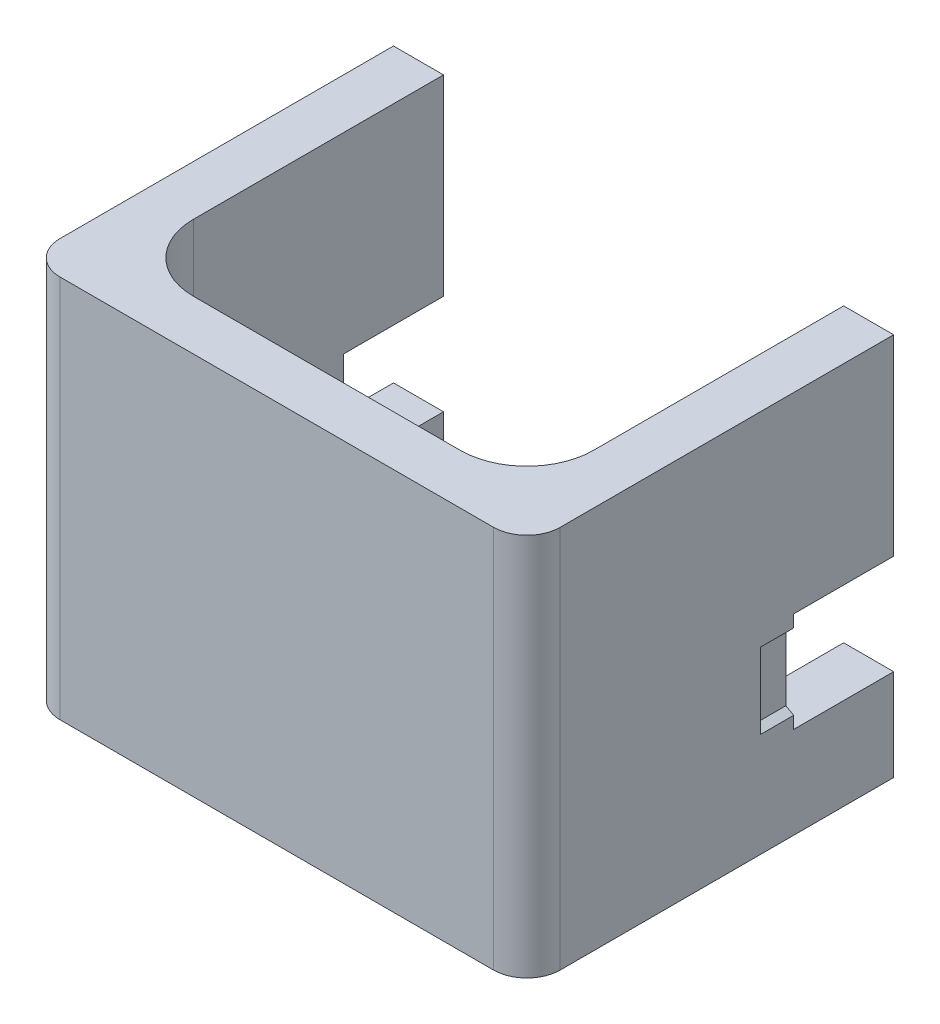
ISO-10303-21;
HEADER;
FILE_DESCRIPTION(('STEP AP214'),'2;1');
FILE_NAME('part.step','',(''),(''),'','','');
FILE_SCHEMA(('AUTOMOTIVE_DESIGN { 1 0 10303 214 1 1 1 1 }'));
ENDSEC;
DATA;
#1=APPLICATION_CONTEXT('core data for automotive mechanical design processes');
#2=APPLICATION_PROTOCOL_DEFINITION('international standard','automotive_design',2000,#1);
#3=PRODUCT_CONTEXT('',#1,'mechanical');
#4=PRODUCT('Part','Part','',(#3));
#5=PRODUCT_RELATED_PRODUCT_CATEGORY('part','',(#4));
#6=PRODUCT_DEFINITION_FORMATION('','',#4);
#7=PRODUCT_DEFINITION_CONTEXT('part definition',#1,'design');
#8=PRODUCT_DEFINITION('design','',#6,#7);
#9=PRODUCT_DEFINITION_SHAPE('','',#8);
#10=(LENGTH_UNIT() NAMED_UNIT(*) SI_UNIT(.MILLI.,.METRE.));
#11=(NAMED_UNIT(*) PLANE_ANGLE_UNIT() SI_UNIT($,.RADIAN.));
#12=(NAMED_UNIT(*) SI_UNIT($,.STERADIAN.) SOLID_ANGLE_UNIT());
#13=UNCERTAINTY_MEASURE_WITH_UNIT(LENGTH_MEASURE(1.E-05),#10,'distance_accuracy_value','');
#14=(GEOMETRIC_REPRESENTATION_CONTEXT(3) GLOBAL_UNCERTAINTY_ASSIGNED_CONTEXT((#13)) GLOBAL_UNIT_ASSIGNED_CONTEXT((#10,
#11,#12)) REPRESENTATION_CONTEXT('',''));
#15=CARTESIAN_POINT('',(0.,0.,0.));
#16=DIRECTION('',(0.,0.,1.));
#17=DIRECTION('',(1.,0.,0.));
#18=AXIS2_PLACEMENT_3D('',#15,#16,#17);
#19=CARTESIAN_POINT('',(7.5,0.,0.));
#20=DIRECTION('',(0.,0.,-1.));
#21=DIRECTION('',(-1.,0.,0.));
#22=AXIS2_PLACEMENT_3D('',#19,#20,#21);
#23=PLANE('',#22);
#24=DIRECTION('',(4.40795796513898E-09,1.,0.));
#25=VECTOR('',#24,1.);
#26=CARTESIAN_POINT('',(7.5,2.75,0.));
#27=LINE('',#26,#25);
#28=CARTESIAN_POINT('',(7.49999996253236,-5.75,0.));
#29=VERTEX_POINT('',#28);
#30=CARTESIAN_POINT('',(7.49999997465424,-2.99999999999994,0.));
#31=VERTEX_POINT('',#30);
#32=EDGE_CURVE('E318',#29,#31,#27,.T.);
#33=ORIENTED_EDGE('',*,*,#32,.F.);
#34=DIRECTION('',(1.,0.,0.));
#35=VECTOR('',#34,1.);
#36=CARTESIAN_POINT('',(6.,-5.75,0.));
#37=LINE('',#36,#35);
#38=CARTESIAN_POINT('',(6.,-5.75,0.));
#39=VERTEX_POINT('',#38);
#40=EDGE_CURVE('E326',#39,#29,#37,.T.);
#41=ORIENTED_EDGE('',*,*,#40,.F.);
#42=DIRECTION('',(0.,1.,0.));
#43=VECTOR('',#42,1.);
#44=CARTESIAN_POINT('',(6.,0.,0.));
#45=LINE('',#44,#43);
#46=CARTESIAN_POINT('',(6.,-2.99999999999994,0.));
#47=VERTEX_POINT('',#46);
#48=EDGE_CURVE('E205',#39,#47,#45,.T.);
#49=ORIENTED_EDGE('',*,*,#48,.T.);
#50=DIRECTION('',(1.,0.,0.));
#51=VECTOR('',#50,1.);
#52=CARTESIAN_POINT('',(6.75,-2.99999999999994,0.));
#53=LINE('',#52,#51);
#54=EDGE_CURVE('E329',#47,#31,#53,.T.);
#55=ORIENTED_EDGE('',*,*,#54,.T.);
#56=EDGE_LOOP('',(#33,#41,#49,#55));
#57=FACE_BOUND('',#56,.T.);
#58=ADVANCED_FACE('F41',(#57),#23,.T.);
#59=CARTESIAN_POINT('',(-6.,0.,0.));
#60=DIRECTION('',(0.,0.,-1.));
#61=DIRECTION('',(0.,-1.,0.));
#62=AXIS2_PLACEMENT_3D('',#59,#60,#61);
#63=PLANE('',#62);
#64=DIRECTION('',(-1.,0.,0.));
#65=VECTOR('',#64,1.);
#66=CARTESIAN_POINT('',(-6.75,0.,0.));
#67=LINE('',#66,#65);
#68=CARTESIAN_POINT('',(-6.,0.,0.));
#69=VERTEX_POINT('',#68);
#70=CARTESIAN_POINT('',(-7.50000001212188,0.,0.));
#71=VERTEX_POINT('',#70);
#72=EDGE_CURVE('E352',#69,#71,#67,.T.);
#73=ORIENTED_EDGE('',*,*,#72,.T.);
#74=DIRECTION('',(0.,1.,0.));
#75=VECTOR('',#74,1.);
#76=CARTESIAN_POINT('',(-7.5,0.,0.));
#77=LINE('',#76,#75);
#78=CARTESIAN_POINT('',(-7.5,5.75,0.));
#79=VERTEX_POINT('',#78);
#80=EDGE_CURVE('E405',#71,#79,#77,.T.);
#81=ORIENTED_EDGE('',*,*,#80,.T.);
#82=DIRECTION('',(-1.,0.,0.));
#83=VECTOR('',#82,1.);
#84=CARTESIAN_POINT('',(-7.5,5.75,0.));
#85=LINE('',#84,#83);
#86=CARTESIAN_POINT('',(-6.,5.75,0.));
#87=VERTEX_POINT('',#86);
#88=EDGE_CURVE('E406',#87,#79,#85,.T.);
#89=ORIENTED_EDGE('',*,*,#88,.F.);
#90=DIRECTION('',(0.,1.,0.));
#91=VECTOR('',#90,1.);
#92=CARTESIAN_POINT('',(-6.,0.,0.));
#93=LINE('',#92,#91);
#94=EDGE_CURVE('E535',#69,#87,#93,.T.);
#95=ORIENTED_EDGE('',*,*,#94,.F.);
#96=EDGE_LOOP('',(#73,#81,#89,#95));
#97=FACE_BOUND('',#96,.T.);
#98=ADVANCED_FACE('F747',(#97),#63,.T.);
#99=CARTESIAN_POINT('',(-4.68345473514375E-08,5.75,5.5));
#100=DIRECTION('',(0.,1.,0.));
#101=DIRECTION('',(1.,0.,0.));
#102=AXIS2_PLACEMENT_3D('',#99,#100,#101);
#103=PLANE('',#102);
#104=CARTESIAN_POINT('',(-6.5000000936691,5.75,10.));
#105=DIRECTION('',(0.,1.,0.));
#106=DIRECTION('',(-1.,0.,-9.36691169073357E-09));
#107=AXIS2_PLACEMENT_3D('',#104,#105,#106);
#108=CIRCLE('',#107,1.);
#109=CARTESIAN_POINT('',(-7.5000000936691,5.75,9.99999999063309));
#110=VERTEX_POINT('',#109);
#111=CARTESIAN_POINT('',(-6.50000009366909,5.75,11.));
#112=VERTEX_POINT('',#111);
#113=EDGE_CURVE('E11',#110,#112,#108,.T.);
#114=ORIENTED_EDGE('',*,*,#113,.T.);
#115=DIRECTION('',(1.,0.,0.));
#116=VECTOR('',#115,1.);
#117=CARTESIAN_POINT('',(6.49999990633091,5.75,11.));
#118=LINE('',#117,#116);
#119=CARTESIAN_POINT('',(6.49999990633091,5.75,11.));
#120=VERTEX_POINT('',#119);
#121=EDGE_CURVE('E430',#112,#120,#118,.T.);
#122=ORIENTED_EDGE('',*,*,#121,.T.);
#123=CARTESIAN_POINT('',(6.49999990633091,5.75,10.));
#124=DIRECTION('',(0.,1.,0.));
#125=DIRECTION('',(0.,0.,1.));
#126=AXIS2_PLACEMENT_3D('',#123,#124,#125);
#127=CIRCLE('',#126,1.);
#128=CARTESIAN_POINT('',(7.4999999063309,5.75,10.0000000093669));
#129=VERTEX_POINT('',#128);
#130=EDGE_CURVE('E454',#120,#129,#127,.T.);
#131=ORIENTED_EDGE('',*,*,#130,.T.);
#132=DIRECTION('',(9.36690968355822E-09,0.,-1.));
#133=VECTOR('',#132,1.);
#134=CARTESIAN_POINT('',(7.5,5.75,0.));
#135=LINE('',#134,#133);
#136=CARTESIAN_POINT('',(7.5,5.75,0.));
#137=VERTEX_POINT('',#136);
#138=EDGE_CURVE('E401',#129,#137,#135,.T.);
#139=ORIENTED_EDGE('',*,*,#138,.T.);
#140=DIRECTION('',(-1.,0.,0.));
#141=VECTOR('',#140,1.);
#142=CARTESIAN_POINT('',(6.,5.75,0.));
#143=LINE('',#142,#141);
#144=CARTESIAN_POINT('',(6.,5.75,0.));
#145=VERTEX_POINT('',#144);
#146=EDGE_CURVE('E449',#137,#145,#143,.T.);
#147=ORIENTED_EDGE('',*,*,#146,.T.);
#148=DIRECTION('',(0.,0.,1.));
#149=VECTOR('',#148,1.);
#150=CARTESIAN_POINT('',(6.,5.75,7.5));
#151=LINE('',#150,#149);
#152=CARTESIAN_POINT('',(6.,5.75,7.5));
#153=VERTEX_POINT('',#152);
#154=EDGE_CURVE('E477',#145,#153,#151,.T.);
#155=ORIENTED_EDGE('',*,*,#154,.T.);
#156=CARTESIAN_POINT('',(4.,5.75,7.5));
#157=DIRECTION('',(0.,-1.,0.));
#158=DIRECTION('',(0.,0.,1.));
#159=AXIS2_PLACEMENT_3D('',#156,#157,#158);
#160=CIRCLE('',#159,2.);
#161=CARTESIAN_POINT('',(4.,5.75,9.5));
#162=VERTEX_POINT('',#161);
#163=EDGE_CURVE('E446',#153,#162,#160,.T.);
#164=ORIENTED_EDGE('',*,*,#163,.T.);
#165=DIRECTION('',(-1.,0.,0.));
#166=VECTOR('',#165,1.);
#167=CARTESIAN_POINT('',(-4.,5.75,9.5));
#168=LINE('',#167,#166);
#169=CARTESIAN_POINT('',(-4.,5.75,9.5));
#170=VERTEX_POINT('',#169);
#171=EDGE_CURVE('E537',#162,#170,#168,.T.);
#172=ORIENTED_EDGE('',*,*,#171,.T.);
#173=CARTESIAN_POINT('',(-4.,5.75,7.5));
#174=DIRECTION('',(0.,-1.,0.));
#175=DIRECTION('',(-1.,0.,0.));
#176=AXIS2_PLACEMENT_3D('',#173,#174,#175);
#177=CIRCLE('',#176,2.);
#178=CARTESIAN_POINT('',(-6.,5.75,7.5));
#179=VERTEX_POINT('',#178);
#180=EDGE_CURVE('E409',#170,#179,#177,.T.);
#181=ORIENTED_EDGE('',*,*,#180,.T.);
#182=DIRECTION('',(0.,0.,-1.));
#183=VECTOR('',#182,1.);
#184=CARTESIAN_POINT('',(-6.,5.75,0.));
#185=LINE('',#184,#183);
#186=EDGE_CURVE('E350',#179,#87,#185,.T.);
#187=ORIENTED_EDGE('',*,*,#186,.T.);
#188=ORIENTED_EDGE('',*,*,#88,.T.);
#189=DIRECTION('',(-9.36690947906141E-09,0.,1.));
#190=VECTOR('',#189,1.);
#191=CARTESIAN_POINT('',(-7.5000000936691,5.75,9.99999999063309));
#192=LINE('',#191,#190);
#193=EDGE_CURVE('E402',#79,#110,#192,.T.);
#194=ORIENTED_EDGE('',*,*,#193,.T.);
#195=EDGE_LOOP('',(#114,#122,#131,#139,#147,#155,#164,#172,#181,#187,#188,#194));
#196=FACE_BOUND('',#195,.T.);
#197=ADVANCED_FACE('F754',(#196),#103,.T.);
#198=CARTESIAN_POINT('',(-6.5000000936691,0.,10.));
#199=DIRECTION('',(0.,1.,0.));
#200=DIRECTION('',(-1.,0.,-9.36691169073357E-09));
#201=AXIS2_PLACEMENT_3D('',#198,#199,#200);
#202=CYLINDRICAL_SURFACE('',#201,1.);
#203=DIRECTION('',(0.,1.,0.));
#204=VECTOR('',#203,1.);
#205=CARTESIAN_POINT('',(-6.50000009366909,0.,11.));
#206=LINE('',#205,#204);
#207=CARTESIAN_POINT('',(-6.50000009366909,-5.75,11.));
#208=VERTEX_POINT('',#207);
#209=EDGE_CURVE('E52',#208,#112,#206,.T.);
#210=ORIENTED_EDGE('',*,*,#209,.T.);
#211=ORIENTED_EDGE('',*,*,#113,.F.);
#212=DIRECTION('',(0.,-1.,0.));
#213=VECTOR('',#212,1.);
#214=CARTESIAN_POINT('',(-7.5000000936691,0.,9.99999999063309));
#215=LINE('',#214,#213);
#216=CARTESIAN_POINT('',(-7.5000000936691,-5.75,9.99999999063309));
#217=VERTEX_POINT('',#216);
#218=EDGE_CURVE('E233',#110,#217,#215,.T.);
#219=ORIENTED_EDGE('',*,*,#218,.T.);
#220=CARTESIAN_POINT('',(-6.5000000936691,-5.75,10.));
#221=DIRECTION('',(0.,-1.,0.));
#222=DIRECTION('',(-1.,0.,-9.36691169073357E-09));
#223=AXIS2_PLACEMENT_3D('',#220,#221,#222);
#224=CIRCLE('',#223,1.);
#225=EDGE_CURVE('E324',#208,#217,#224,.T.);
#226=ORIENTED_EDGE('',*,*,#225,.F.);
#227=EDGE_LOOP('',(#210,#211,#219,#226));
#228=FACE_BOUND('',#227,.T.);
#229=ADVANCED_FACE('F946',(#228),#202,.T.);
#230=CARTESIAN_POINT('',(-6.50000009366909,0.,11.));
#231=DIRECTION('',(0.,0.,1.));
#232=DIRECTION('',(1.,0.,0.));
#233=AXIS2_PLACEMENT_3D('',#230,#231,#232);
#234=PLANE('',#233);
#235=DIRECTION('',(0.,1.,0.));
#236=VECTOR('',#235,1.);
#237=CARTESIAN_POINT('',(6.49999990633091,0.,11.));
#238=LINE('',#237,#236);
#239=CARTESIAN_POINT('',(6.49999990633091,-5.75,11.));
#240=VERTEX_POINT('',#239);
#241=EDGE_CURVE('E450',#240,#120,#238,.T.);
#242=ORIENTED_EDGE('',*,*,#241,.T.);
#243=ORIENTED_EDGE('',*,*,#121,.F.);
#244=ORIENTED_EDGE('',*,*,#209,.F.);
#245=DIRECTION('',(-1.,0.,0.));
#246=VECTOR('',#245,1.);
#247=CARTESIAN_POINT('',(6.49999990633091,-5.75,11.));
#248=LINE('',#247,#246);
#249=EDGE_CURVE('E344',#240,#208,#248,.T.);
#250=ORIENTED_EDGE('',*,*,#249,.F.);
#251=EDGE_LOOP('',(#242,#243,#244,#250));
#252=FACE_BOUND('',#251,.T.);
#253=ADVANCED_FACE('F768',(#252),#234,.T.);
#254=CARTESIAN_POINT('',(6.49999990633091,0.,10.));
#255=DIRECTION('',(0.,1.,0.));
#256=DIRECTION('',(0.,0.,1.));
#257=AXIS2_PLACEMENT_3D('',#254,#255,#256);
#258=CYLINDRICAL_SURFACE('',#257,1.);
#259=DIRECTION('',(0.,1.,0.));
#260=VECTOR('',#259,1.);
#261=CARTESIAN_POINT('',(7.4999999063309,0.,10.0000000093669));
#262=LINE('',#261,#260);
#263=CARTESIAN_POINT('',(7.4999999063309,-5.75,10.0000000093669));
#264=VERTEX_POINT('',#263);
#265=EDGE_CURVE('E320',#264,#129,#262,.T.);
#266=ORIENTED_EDGE('',*,*,#265,.T.);
#267=ORIENTED_EDGE('',*,*,#130,.F.);
#268=ORIENTED_EDGE('',*,*,#241,.F.);
#269=CARTESIAN_POINT('',(6.49999990633091,-5.75,10.));
#270=DIRECTION('',(0.,-1.,0.));
#271=DIRECTION('',(0.,0.,1.));
#272=AXIS2_PLACEMENT_3D('',#269,#270,#271);
#273=CIRCLE('',#272,1.);
#274=EDGE_CURVE('E337',#264,#240,#273,.T.);
#275=ORIENTED_EDGE('',*,*,#274,.F.);
#276=EDGE_LOOP('',(#266,#267,#268,#275));
#277=FACE_BOUND('',#276,.T.);
#278=ADVANCED_FACE('F760',(#277),#258,.T.);
#279=DIRECTION('',(0.,1.,0.));
#280=VECTOR('',#279,1.);
#281=CARTESIAN_POINT('',(7.5,0.,0.));
#282=LINE('',#281,#280);
#283=CARTESIAN_POINT('',(7.49999998787812,0.,0.));
#284=VERTEX_POINT('',#283);
#285=EDGE_CURVE('E397',#284,#137,#282,.T.);
#286=ORIENTED_EDGE('',*,*,#285,.F.);
#287=DIRECTION('',(-1.,0.,0.));
#288=VECTOR('',#287,1.);
#289=CARTESIAN_POINT('',(7.5,0.,0.));
#290=LINE('',#289,#288);
#291=CARTESIAN_POINT('',(6.,0.,0.));
#292=VERTEX_POINT('',#291);
#293=EDGE_CURVE('E487',#284,#292,#290,.T.);
#294=ORIENTED_EDGE('',*,*,#293,.T.);
#295=DIRECTION('',(0.,1.,0.));
#296=VECTOR('',#295,1.);
#297=CARTESIAN_POINT('',(6.,0.,0.));
#298=LINE('',#297,#296);
#299=EDGE_CURVE('E216',#292,#145,#298,.T.);
#300=ORIENTED_EDGE('',*,*,#299,.T.);
#301=ORIENTED_EDGE('',*,*,#146,.F.);
#302=EDGE_LOOP('',(#286,#294,#300,#301));
#303=FACE_BOUND('',#302,.T.);
#304=ADVANCED_FACE('F748',(#303),#23,.T.);
#305=CARTESIAN_POINT('',(4.,0.,7.5));
#306=DIRECTION('',(0.,1.,0.));
#307=DIRECTION('',(0.,0.,1.));
#308=AXIS2_PLACEMENT_3D('',#305,#306,#307);
#309=CYLINDRICAL_SURFACE('',#308,2.);
#310=DIRECTION('',(0.,1.,0.));
#311=VECTOR('',#310,1.);
#312=CARTESIAN_POINT('',(4.,0.,9.5));
#313=LINE('',#312,#311);
#314=CARTESIAN_POINT('',(4.,-5.75,9.5));
#315=VERTEX_POINT('',#314);
#316=EDGE_CURVE('E249',#315,#162,#313,.T.);
#317=ORIENTED_EDGE('',*,*,#316,.T.);
#318=ORIENTED_EDGE('',*,*,#163,.F.);
#319=DIRECTION('',(0.,1.,0.));
#320=VECTOR('',#319,1.);
#321=CARTESIAN_POINT('',(6.,0.,7.5));
#322=LINE('',#321,#320);
#323=CARTESIAN_POINT('',(6.,-5.75,7.5));
#324=VERTEX_POINT('',#323);
#325=EDGE_CURVE('E396',#324,#153,#322,.T.);
#326=ORIENTED_EDGE('',*,*,#325,.F.);
#327=CARTESIAN_POINT('',(4.,-5.75,7.5));
#328=DIRECTION('',(0.,1.,0.));
#329=DIRECTION('',(0.,0.,1.));
#330=AXIS2_PLACEMENT_3D('',#327,#328,#329);
#331=CIRCLE('',#330,2.);
#332=EDGE_CURVE('E338',#315,#324,#331,.T.);
#333=ORIENTED_EDGE('',*,*,#332,.F.);
#334=EDGE_LOOP('',(#317,#318,#326,#333));
#335=FACE_BOUND('',#334,.T.);
#336=ADVANCED_FACE('F759',(#335),#309,.F.);
#337=CARTESIAN_POINT('',(4.,0.,9.5));
#338=DIRECTION('',(0.,0.,-1.));
#339=DIRECTION('',(-1.,0.,0.));
#340=AXIS2_PLACEMENT_3D('',#337,#338,#339);
#341=PLANE('',#340);
#342=DIRECTION('',(0.,1.,0.));
#343=VECTOR('',#342,1.);
#344=CARTESIAN_POINT('',(-4.,0.,9.5));
#345=LINE('',#344,#343);
#346=CARTESIAN_POINT('',(-4.,-5.75,9.5));
#347=VERTEX_POINT('',#346);
#348=EDGE_CURVE('E240',#347,#170,#345,.T.);
#349=ORIENTED_EDGE('',*,*,#348,.T.);
#350=ORIENTED_EDGE('',*,*,#171,.F.);
#351=ORIENTED_EDGE('',*,*,#316,.F.);
#352=DIRECTION('',(1.,0.,0.));
#353=VECTOR('',#352,1.);
#354=CARTESIAN_POINT('',(-4.,-5.75,9.5));
#355=LINE('',#354,#353);
#356=EDGE_CURVE('E346',#347,#315,#355,.T.);
#357=ORIENTED_EDGE('',*,*,#356,.F.);
#358=EDGE_LOOP('',(#349,#350,#351,#357));
#359=FACE_BOUND('',#358,.T.);
#360=ADVANCED_FACE('F765',(#359),#341,.T.);
#361=CARTESIAN_POINT('',(-4.,0.,7.5));
#362=DIRECTION('',(0.,1.,0.));
#363=DIRECTION('',(-1.,0.,0.));
#364=AXIS2_PLACEMENT_3D('',#361,#362,#363);
#365=CYLINDRICAL_SURFACE('',#364,2.);
#366=DIRECTION('',(0.,1.,0.));
#367=VECTOR('',#366,1.);
#368=CARTESIAN_POINT('',(-6.,0.,7.5));
#369=LINE('',#368,#367);
#370=CARTESIAN_POINT('',(-6.,-5.75,7.5));
#371=VERTEX_POINT('',#370);
#372=EDGE_CURVE('E523',#371,#179,#369,.T.);
#373=ORIENTED_EDGE('',*,*,#372,.T.);
#374=ORIENTED_EDGE('',*,*,#180,.F.);
#375=ORIENTED_EDGE('',*,*,#348,.F.);
#376=CARTESIAN_POINT('',(-4.,-5.75,7.5));
#377=DIRECTION('',(0.,1.,0.));
#378=DIRECTION('',(-1.,0.,0.));
#379=AXIS2_PLACEMENT_3D('',#376,#377,#378);
#380=CIRCLE('',#379,2.);
#381=EDGE_CURVE('E455',#371,#347,#380,.T.);
#382=ORIENTED_EDGE('',*,*,#381,.F.);
#383=EDGE_LOOP('',(#373,#374,#375,#382));
#384=FACE_BOUND('',#383,.T.);
#385=ADVANCED_FACE('F43',(#384),#365,.F.);
#386=DIRECTION('',(-4.4079576590113E-09,-1.,0.));
#387=VECTOR('',#386,1.);
#388=CARTESIAN_POINT('',(-7.5,2.75,0.));
#389=LINE('',#388,#387);
#390=CARTESIAN_POINT('',(-7.50000002534576,-2.99999999999994,0.));
#391=VERTEX_POINT('',#390);
#392=CARTESIAN_POINT('',(-7.50000003746764,-5.75,0.));
#393=VERTEX_POINT('',#392);
#394=EDGE_CURVE('E724',#391,#393,#389,.T.);
#395=ORIENTED_EDGE('',*,*,#394,.F.);
#396=DIRECTION('',(1.,0.,0.));
#397=VECTOR('',#396,1.);
#398=CARTESIAN_POINT('',(-6.,-2.99999999999994,0.));
#399=LINE('',#398,#397);
#400=CARTESIAN_POINT('',(-6.,-2.99999999999994,0.));
#401=VERTEX_POINT('',#400);
#402=EDGE_CURVE('E356',#391,#401,#399,.T.);
#403=ORIENTED_EDGE('',*,*,#402,.T.);
#404=DIRECTION('',(0.,1.,0.));
#405=VECTOR('',#404,1.);
#406=CARTESIAN_POINT('',(-6.,0.,0.));
#407=LINE('',#406,#405);
#408=CARTESIAN_POINT('',(-6.,-5.75,0.));
#409=VERTEX_POINT('',#408);
#410=EDGE_CURVE('E410',#409,#401,#407,.T.);
#411=ORIENTED_EDGE('',*,*,#410,.F.);
#412=DIRECTION('',(-1.,0.,0.));
#413=VECTOR('',#412,1.);
#414=CARTESIAN_POINT('',(-7.5,-5.75,0.));
#415=LINE('',#414,#413);
#416=EDGE_CURVE('E195',#409,#393,#415,.T.);
#417=ORIENTED_EDGE('',*,*,#416,.T.);
#418=EDGE_LOOP('',(#395,#403,#411,#417));
#419=FACE_BOUND('',#418,.T.);
#420=ADVANCED_FACE('F757',(#419),#63,.T.);
#421=CARTESIAN_POINT('',(-7.5,0.,0.));
#422=DIRECTION('',(-1.,0.,-9.36690947906141E-09));
#423=DIRECTION('',(-9.36690947906141E-09,0.,1.));
#424=AXIS2_PLACEMENT_3D('',#421,#422,#423);
#425=PLANE('',#424);
#426=DIRECTION('',(9.36690947906141E-09,0.,-1.));
#427=VECTOR('',#426,1.);
#428=CARTESIAN_POINT('',(-7.5000000936691,-5.75,9.99999999063309));
#429=LINE('',#428,#427);
#430=EDGE_CURVE('E485',#217,#393,#429,.T.);
#431=ORIENTED_EDGE('',*,*,#430,.F.);
#432=ORIENTED_EDGE('',*,*,#218,.F.);
#433=ORIENTED_EDGE('',*,*,#193,.F.);
#434=ORIENTED_EDGE('',*,*,#80,.F.);
#435=DIRECTION('',(0.,0.,1.));
#436=VECTOR('',#435,1.);
#437=CARTESIAN_POINT('',(-7.5,0.,0.));
#438=LINE('',#437,#436);
#439=CARTESIAN_POINT('',(-7.50000001212188,0.,3.));
#440=VERTEX_POINT('',#439);
#441=EDGE_CURVE('E414',#71,#440,#438,.T.);
#442=ORIENTED_EDGE('',*,*,#441,.T.);
#443=DIRECTION('',(0.,-1.,0.));
#444=VECTOR('',#443,1.);
#445=CARTESIAN_POINT('',(-7.5,0.,3.));
#446=LINE('',#445,#444);
#447=CARTESIAN_POINT('',(-7.5,-0.366025403784376,3.));
#448=VERTEX_POINT('',#447);
#449=EDGE_CURVE('E427',#440,#448,#446,.T.);
#450=ORIENTED_EDGE('',*,*,#449,.T.);
#451=DIRECTION('',(0.,0.,1.));
#452=VECTOR('',#451,1.);
#453=CARTESIAN_POINT('',(-7.50000001373531,-0.366025395854292,3.));
#454=LINE('',#453,#452);
#455=CARTESIAN_POINT('',(-7.50000001373531,-0.366025382152428,4.));
#456=VERTEX_POINT('',#455);
#457=EDGE_CURVE('E558',#448,#456,#454,.T.);
#458=ORIENTED_EDGE('',*,*,#457,.T.);
#459=DIRECTION('',(0.,1.,0.));
#460=VECTOR('',#459,1.);
#461=CARTESIAN_POINT('',(-7.50000003746764,-0.75,4.00000000936691));
#462=LINE('',#461,#460);
#463=CARTESIAN_POINT('',(-7.50000003746764,-2.63397461784745,4.));
#464=VERTEX_POINT('',#463);
#465=EDGE_CURVE('E364',#464,#456,#462,.T.);
#466=ORIENTED_EDGE('',*,*,#465,.F.);
#467=DIRECTION('',(0.,0.,-1.));
#468=VECTOR('',#467,1.);
#469=CARTESIAN_POINT('',(-7.50000002373233,-2.63397460991737,3.));
#470=LINE('',#469,#468);
#471=CARTESIAN_POINT('',(-7.50000002373233,-2.63397460991737,3.));
#472=VERTEX_POINT('',#471);
#473=EDGE_CURVE('E722',#464,#472,#470,.T.);
#474=ORIENTED_EDGE('',*,*,#473,.T.);
#475=DIRECTION('',(0.,-1.,0.));
#476=VECTOR('',#475,1.);
#477=CARTESIAN_POINT('',(-7.5,0.,3.));
#478=LINE('',#477,#476);
#479=CARTESIAN_POINT('',(-7.50000002534576,-2.99999999999994,3.));
#480=VERTEX_POINT('',#479);
#481=EDGE_CURVE('E374',#472,#480,#478,.T.);
#482=ORIENTED_EDGE('',*,*,#481,.T.);
#483=DIRECTION('',(0.,0.,1.));
#484=VECTOR('',#483,1.);
#485=CARTESIAN_POINT('',(-7.5,-2.99999999999994,0.));
#486=LINE('',#485,#484);
#487=EDGE_CURVE('E437',#391,#480,#486,.T.);
#488=ORIENTED_EDGE('',*,*,#487,.F.);
#489=ORIENTED_EDGE('',*,*,#394,.T.);
#490=EDGE_LOOP('',(#431,#432,#433,#434,#442,#450,#458,#466,#474,#482,#488,#489));
#491=FACE_BOUND('',#490,.T.);
#492=ADVANCED_FACE('F826',(#491),#425,.T.);
#493=CARTESIAN_POINT('',(-4.68345473514375E-08,-5.75,5.5));
#494=DIRECTION('',(0.,1.,0.));
#495=DIRECTION('',(1.,0.,0.));
#496=AXIS2_PLACEMENT_3D('',#493,#494,#495);
#497=PLANE('',#496);
#498=ORIENTED_EDGE('',*,*,#40,.T.);
#499=DIRECTION('',(-9.36690968355822E-09,0.,1.));
#500=VECTOR('',#499,1.);
#501=CARTESIAN_POINT('',(7.5,-5.75,0.));
#502=LINE('',#501,#500);
#503=EDGE_CURVE('E314',#29,#264,#502,.T.);
#504=ORIENTED_EDGE('',*,*,#503,.T.);
#505=ORIENTED_EDGE('',*,*,#274,.T.);
#506=ORIENTED_EDGE('',*,*,#249,.T.);
#507=ORIENTED_EDGE('',*,*,#225,.T.);
#508=ORIENTED_EDGE('',*,*,#430,.T.);
#509=ORIENTED_EDGE('',*,*,#416,.F.);
#510=DIRECTION('',(0.,0.,1.));
#511=VECTOR('',#510,1.);
#512=CARTESIAN_POINT('',(-6.,-5.75,0.));
#513=LINE('',#512,#511);
#514=EDGE_CURVE('E415',#409,#371,#513,.T.);
#515=ORIENTED_EDGE('',*,*,#514,.T.);
#516=ORIENTED_EDGE('',*,*,#381,.T.);
#517=ORIENTED_EDGE('',*,*,#356,.T.);
#518=ORIENTED_EDGE('',*,*,#332,.T.);
#519=DIRECTION('',(0.,0.,-1.));
#520=VECTOR('',#519,1.);
#521=CARTESIAN_POINT('',(6.,-5.75,7.5));
#522=LINE('',#521,#520);
#523=EDGE_CURVE('E335',#324,#39,#522,.T.);
#524=ORIENTED_EDGE('',*,*,#523,.T.);
#525=EDGE_LOOP('',(#498,#504,#505,#506,#507,#508,#509,#515,#516,#517,#518,#524));
#526=FACE_BOUND('',#525,.T.);
#527=ADVANCED_FACE('F333',(#526),#497,.F.);
#528=CARTESIAN_POINT('',(7.4999999063309,0.,10.0000000093669));
#529=DIRECTION('',(1.,0.,9.36690968355822E-09));
#530=DIRECTION('',(0.,-1.,0.));
#531=AXIS2_PLACEMENT_3D('',#528,#529,#530);
#532=PLANE('',#531);
#533=DIRECTION('',(0.,0.,1.));
#534=VECTOR('',#533,1.);
#535=CARTESIAN_POINT('',(7.5,0.,0.));
#536=LINE('',#535,#534);
#537=CARTESIAN_POINT('',(7.49999998787812,0.,3.));
#538=VERTEX_POINT('',#537);
#539=EDGE_CURVE('E431',#284,#538,#536,.T.);
#540=ORIENTED_EDGE('',*,*,#539,.F.);
#541=ORIENTED_EDGE('',*,*,#285,.T.);
#542=ORIENTED_EDGE('',*,*,#138,.F.);
#543=ORIENTED_EDGE('',*,*,#265,.F.);
#544=ORIENTED_EDGE('',*,*,#503,.F.);
#545=ORIENTED_EDGE('',*,*,#32,.T.);
#546=DIRECTION('',(0.,0.,1.));
#547=VECTOR('',#546,1.);
#548=CARTESIAN_POINT('',(7.5,-2.99999999999994,0.));
#549=LINE('',#548,#547);
#550=CARTESIAN_POINT('',(7.49999997465424,-2.99999999999994,3.));
#551=VERTEX_POINT('',#550);
#552=EDGE_CURVE('E530',#31,#551,#549,.T.);
#553=ORIENTED_EDGE('',*,*,#552,.T.);
#554=DIRECTION('',(0.,-1.,0.));
#555=VECTOR('',#554,1.);
#556=CARTESIAN_POINT('',(7.5,0.,3.));
#557=LINE('',#556,#555);
#558=CARTESIAN_POINT('',(7.5,-2.6339745962155,3.));
#559=VERTEX_POINT('',#558);
#560=EDGE_CURVE('E526',#559,#551,#557,.T.);
#561=ORIENTED_EDGE('',*,*,#560,.F.);
#562=DIRECTION('',(0.,0.,-1.));
#563=VECTOR('',#562,1.);
#564=CARTESIAN_POINT('',(7.49999997626767,-2.63397458251363,3.));
#565=LINE('',#564,#563);
#566=CARTESIAN_POINT('',(7.49999997626767,-2.63397458251363,4.));
#567=VERTEX_POINT('',#566);
#568=EDGE_CURVE('E331',#567,#559,#565,.T.);
#569=ORIENTED_EDGE('',*,*,#568,.F.);
#570=DIRECTION('',(0.,-1.,0.));
#571=VECTOR('',#570,1.);
#572=CARTESIAN_POINT('',(7.49999996253236,-0.75,3.99999999063309));
#573=LINE('',#572,#571);
#574=CARTESIAN_POINT('',(7.49999996253236,-0.366025425416329,4.));
#575=VERTEX_POINT('',#574);
#576=EDGE_CURVE('E361',#575,#567,#573,.T.);
#577=ORIENTED_EDGE('',*,*,#576,.F.);
#578=DIRECTION('',(0.,0.,1.));
#579=VECTOR('',#578,1.);
#580=CARTESIAN_POINT('',(7.49999998626469,-0.366025411714459,3.));
#581=LINE('',#580,#579);
#582=CARTESIAN_POINT('',(7.49999998626469,-0.366025411714459,3.));
#583=VERTEX_POINT('',#582);
#584=EDGE_CURVE('E728',#583,#575,#581,.T.);
#585=ORIENTED_EDGE('',*,*,#584,.F.);
#586=DIRECTION('',(0.,-1.,0.));
#587=VECTOR('',#586,1.);
#588=CARTESIAN_POINT('',(7.5,0.,3.));
#589=LINE('',#588,#587);
#590=EDGE_CURVE('E435',#538,#583,#589,.T.);
#591=ORIENTED_EDGE('',*,*,#590,.F.);
#592=EDGE_LOOP('',(#540,#541,#542,#543,#544,#545,#553,#561,#569,#577,#585,#591));
#593=FACE_BOUND('',#592,.T.);
#594=ADVANCED_FACE('F317',(#593),#532,.T.);
#595=CARTESIAN_POINT('',(6.,0.,0.));
#596=DIRECTION('',(-1.,0.,0.));
#597=DIRECTION('',(0.,0.,1.));
#598=AXIS2_PLACEMENT_3D('',#595,#596,#597);
#599=PLANE('',#598);
#600=DIRECTION('',(0.,0.,-1.));
#601=VECTOR('',#600,1.);
#602=CARTESIAN_POINT('',(6.,-2.99999999999994,0.));
#603=LINE('',#602,#601);
#604=CARTESIAN_POINT('',(6.,-2.99999999999994,3.));
#605=VERTEX_POINT('',#604);
#606=EDGE_CURVE('E490',#605,#47,#603,.T.);
#607=ORIENTED_EDGE('',*,*,#606,.T.);
#608=ORIENTED_EDGE('',*,*,#48,.F.);
#609=ORIENTED_EDGE('',*,*,#523,.F.);
#610=ORIENTED_EDGE('',*,*,#325,.T.);
#611=ORIENTED_EDGE('',*,*,#154,.F.);
#612=ORIENTED_EDGE('',*,*,#299,.F.);
#613=DIRECTION('',(0.,0.,1.));
#614=VECTOR('',#613,1.);
#615=CARTESIAN_POINT('',(6.,0.,0.));
#616=LINE('',#615,#614);
#617=CARTESIAN_POINT('',(6.,0.,3.));
#618=VERTEX_POINT('',#617);
#619=EDGE_CURVE('E469',#292,#618,#616,.T.);
#620=ORIENTED_EDGE('',*,*,#619,.T.);
#621=DIRECTION('',(0.,-1.,0.));
#622=VECTOR('',#621,1.);
#623=CARTESIAN_POINT('',(6.,-0.74999999999997,3.));
#624=LINE('',#623,#622);
#625=EDGE_CURVE('E441',#618,#605,#624,.T.);
#626=ORIENTED_EDGE('',*,*,#625,.T.);
#627=EDGE_LOOP('',(#607,#608,#609,#610,#611,#612,#620,#626));
#628=FACE_BOUND('',#627,.T.);
#629=ADVANCED_FACE('F775',(#628),#599,.T.);
#630=CARTESIAN_POINT('',(7.5,0.,0.));
#631=DIRECTION('',(0.,1.,0.));
#632=DIRECTION('',(1.,0.,0.));
#633=AXIS2_PLACEMENT_3D('',#630,#631,#632);
#634=PLANE('',#633);
#635=ORIENTED_EDGE('',*,*,#293,.F.);
#636=ORIENTED_EDGE('',*,*,#539,.T.);
#637=DIRECTION('',(1.,0.,0.));
#638=VECTOR('',#637,1.);
#639=CARTESIAN_POINT('',(6.,0.,3.));
#640=LINE('',#639,#638);
#641=EDGE_CURVE('E445',#618,#538,#640,.T.);
#642=ORIENTED_EDGE('',*,*,#641,.F.);
#643=ORIENTED_EDGE('',*,*,#619,.F.);
#644=EDGE_LOOP('',(#635,#636,#642,#643));
#645=FACE_BOUND('',#644,.T.);
#646=ADVANCED_FACE('F773',(#645),#634,.F.);
#647=CARTESIAN_POINT('',(6.,-2.99999999999994,0.));
#648=DIRECTION('',(0.,-1.,0.));
#649=DIRECTION('',(0.,0.,-1.));
#650=AXIS2_PLACEMENT_3D('',#647,#648,#649);
#651=PLANE('',#650);
#652=ORIENTED_EDGE('',*,*,#54,.F.);
#653=ORIENTED_EDGE('',*,*,#606,.F.);
#654=DIRECTION('',(-1.,0.,0.));
#655=VECTOR('',#654,1.);
#656=CARTESIAN_POINT('',(7.5,-2.99999999999994,3.));
#657=LINE('',#656,#655);
#658=EDGE_CURVE('E434',#551,#605,#657,.T.);
#659=ORIENTED_EDGE('',*,*,#658,.F.);
#660=ORIENTED_EDGE('',*,*,#552,.F.);
#661=EDGE_LOOP('',(#652,#653,#659,#660));
#662=FACE_BOUND('',#661,.T.);
#663=ADVANCED_FACE('F778',(#662),#651,.F.);
#664=CARTESIAN_POINT('',(-7.5,0.,0.));
#665=DIRECTION('',(0.,-1.,0.));
#666=DIRECTION('',(0.,0.,-1.));
#667=AXIS2_PLACEMENT_3D('',#664,#665,#666);
#668=PLANE('',#667);
#669=ORIENTED_EDGE('',*,*,#72,.F.);
#670=DIRECTION('',(0.,0.,-1.));
#671=VECTOR('',#670,1.);
#672=CARTESIAN_POINT('',(-6.,0.,3.75));
#673=LINE('',#672,#671);
#674=CARTESIAN_POINT('',(-6.,0.,3.));
#675=VERTEX_POINT('',#674);
#676=EDGE_CURVE('E531',#675,#69,#673,.T.);
#677=ORIENTED_EDGE('',*,*,#676,.F.);
#678=DIRECTION('',(-1.,0.,0.));
#679=VECTOR('',#678,1.);
#680=CARTESIAN_POINT('',(-6.,0.,3.));
#681=LINE('',#680,#679);
#682=EDGE_CURVE('E422',#675,#440,#681,.T.);
#683=ORIENTED_EDGE('',*,*,#682,.T.);
#684=ORIENTED_EDGE('',*,*,#441,.F.);
#685=EDGE_LOOP('',(#669,#677,#683,#684));
#686=FACE_BOUND('',#685,.T.);
#687=ADVANCED_FACE('F780',(#686),#668,.T.);
#688=CARTESIAN_POINT('',(-6.,-2.99999999999994,0.));
#689=DIRECTION('',(0.,1.,0.));
#690=DIRECTION('',(1.,0.,0.));
#691=AXIS2_PLACEMENT_3D('',#688,#689,#690);
#692=PLANE('',#691);
#693=ORIENTED_EDGE('',*,*,#402,.F.);
#694=ORIENTED_EDGE('',*,*,#487,.T.);
#695=DIRECTION('',(1.,0.,0.));
#696=VECTOR('',#695,1.);
#697=CARTESIAN_POINT('',(-7.5,-2.99999999999994,3.));
#698=LINE('',#697,#696);
#699=CARTESIAN_POINT('',(-6.,-2.99999999999994,3.));
#700=VERTEX_POINT('',#699);
#701=EDGE_CURVE('E567',#480,#700,#698,.T.);
#702=ORIENTED_EDGE('',*,*,#701,.T.);
#703=DIRECTION('',(0.,0.,1.));
#704=VECTOR('',#703,1.);
#705=CARTESIAN_POINT('',(-6.,-2.99999999999994,3.75));
#706=LINE('',#705,#704);
#707=EDGE_CURVE('E536',#401,#700,#706,.T.);
#708=ORIENTED_EDGE('',*,*,#707,.F.);
#709=EDGE_LOOP('',(#693,#694,#702,#708));
#710=FACE_BOUND('',#709,.T.);
#711=ADVANCED_FACE('F787',(#710),#692,.T.);
#712=CARTESIAN_POINT('',(-6.,0.,7.5));
#713=DIRECTION('',(1.,0.,0.));
#714=DIRECTION('',(0.,0.,-1.));
#715=AXIS2_PLACEMENT_3D('',#712,#713,#714);
#716=PLANE('',#715);
#717=ORIENTED_EDGE('',*,*,#707,.T.);
#718=DIRECTION('',(0.,1.,0.));
#719=VECTOR('',#718,1.);
#720=CARTESIAN_POINT('',(-6.,-0.74999999999997,3.));
#721=LINE('',#720,#719);
#722=EDGE_CURVE('E426',#700,#675,#721,.T.);
#723=ORIENTED_EDGE('',*,*,#722,.T.);
#724=ORIENTED_EDGE('',*,*,#676,.T.);
#725=ORIENTED_EDGE('',*,*,#94,.T.);
#726=ORIENTED_EDGE('',*,*,#186,.F.);
#727=ORIENTED_EDGE('',*,*,#372,.F.);
#728=ORIENTED_EDGE('',*,*,#514,.F.);
#729=ORIENTED_EDGE('',*,*,#410,.T.);
#730=EDGE_LOOP('',(#717,#723,#724,#725,#726,#727,#728,#729));
#731=FACE_BOUND('',#730,.T.);
#732=ADVANCED_FACE('F797',(#731),#716,.T.);
#733=CARTESIAN_POINT('',(-6.75,-1.49999999999994,3.));
#734=DIRECTION('',(0.,0.,1.));
#735=DIRECTION('',(1.,0.,0.));
#736=AXIS2_PLACEMENT_3D('',#733,#734,#735);
#737=PLANE('',#736);
#738=DIRECTION('',(-0.866025403784439,0.5,0.));
#739=VECTOR('',#738,1.);
#740=CARTESIAN_POINT('',(-7.72323729810778,-0.237139289628685,3.));
#741=LINE('',#740,#739);
#742=CARTESIAN_POINT('',(-7.26794919243113,-0.499999999999938,3.));
#743=VERTEX_POINT('',#742);
#744=EDGE_CURVE('E365',#743,#448,#741,.T.);
#745=ORIENTED_EDGE('',*,*,#744,.T.);
#746=ORIENTED_EDGE('',*,*,#449,.F.);
#747=ORIENTED_EDGE('',*,*,#682,.F.);
#748=ORIENTED_EDGE('',*,*,#722,.F.);
#749=ORIENTED_EDGE('',*,*,#701,.F.);
#750=ORIENTED_EDGE('',*,*,#481,.F.);
#751=DIRECTION('',(0.866025403784439,0.5,0.));
#752=VECTOR('',#751,1.);
#753=CARTESIAN_POINT('',(-6.85721189432335,-2.26286071037119,3.));
#754=LINE('',#753,#752);
#755=CARTESIAN_POINT('',(-7.26794919243113,-2.49999999999994,3.));
#756=VERTEX_POINT('',#755);
#757=EDGE_CURVE('E459',#472,#756,#754,.T.);
#758=ORIENTED_EDGE('',*,*,#757,.T.);
#759=DIRECTION('',(0.,1.,0.));
#760=VECTOR('',#759,1.);
#761=CARTESIAN_POINT('',(-7.26794919243113,-0.999999999999939,3.));
#762=LINE('',#761,#760);
#763=EDGE_CURVE('E463',#756,#743,#762,.T.);
#764=ORIENTED_EDGE('',*,*,#763,.T.);
#765=EDGE_LOOP('',(#745,#746,#747,#748,#749,#750,#758,#764));
#766=FACE_BOUND('',#765,.T.);
#767=ADVANCED_FACE('F802',(#766),#737,.F.);
#768=CARTESIAN_POINT('',(6.75,-1.49999999999994,3.));
#769=DIRECTION('',(0.,0.,-1.));
#770=DIRECTION('',(-1.,0.,0.));
#771=AXIS2_PLACEMENT_3D('',#768,#769,#770);
#772=PLANE('',#771);
#773=DIRECTION('',(-0.866025403784439,-0.5,0.));
#774=VECTOR('',#773,1.);
#775=CARTESIAN_POINT('',(7.72323729810778,-0.237139289628685,3.));
#776=LINE('',#775,#774);
#777=CARTESIAN_POINT('',(7.26794919243113,-0.499999999999938,3.));
#778=VERTEX_POINT('',#777);
#779=EDGE_CURVE('E392',#583,#778,#776,.T.);
#780=ORIENTED_EDGE('',*,*,#779,.T.);
#781=DIRECTION('',(0.,-1.,0.));
#782=VECTOR('',#781,1.);
#783=CARTESIAN_POINT('',(7.26794919243113,-0.999999999999939,3.));
#784=LINE('',#783,#782);
#785=CARTESIAN_POINT('',(7.26794919243113,-2.49999999999994,3.));
#786=VERTEX_POINT('',#785);
#787=EDGE_CURVE('E45',#778,#786,#784,.T.);
#788=ORIENTED_EDGE('',*,*,#787,.T.);
#789=DIRECTION('',(0.866025403784439,-0.5,0.));
#790=VECTOR('',#789,1.);
#791=CARTESIAN_POINT('',(6.85721189432335,-2.26286071037119,3.));
#792=LINE('',#791,#790);
#793=EDGE_CURVE('E360',#786,#559,#792,.T.);
#794=ORIENTED_EDGE('',*,*,#793,.T.);
#795=ORIENTED_EDGE('',*,*,#560,.T.);
#796=ORIENTED_EDGE('',*,*,#658,.T.);
#797=ORIENTED_EDGE('',*,*,#625,.F.);
#798=ORIENTED_EDGE('',*,*,#641,.T.);
#799=ORIENTED_EDGE('',*,*,#590,.T.);
#800=EDGE_LOOP('',(#780,#788,#794,#795,#796,#797,#798,#799));
#801=FACE_BOUND('',#800,.T.);
#802=ADVANCED_FACE('F589',(#801),#772,.T.);
#803=CARTESIAN_POINT('',(7.26794919243113,-2.49999999999994,3.));
#804=DIRECTION('',(-0.5,-0.866025403784439,0.));
#805=DIRECTION('',(-0.866025403784439,0.5,0.));
#806=AXIS2_PLACEMENT_3D('',#803,#804,#805);
#807=PLANE('',#806);
#808=DIRECTION('',(0.866025403784439,-0.5,0.));
#809=VECTOR('',#808,1.);
#810=CARTESIAN_POINT('',(7.26794919243113,-2.49999999999994,4.));
#811=LINE('',#810,#809);
#812=CARTESIAN_POINT('',(7.26794919243113,-2.49999999999994,4.));
#813=VERTEX_POINT('',#812);
#814=EDGE_CURVE('E357',#813,#567,#811,.T.);
#815=ORIENTED_EDGE('',*,*,#814,.T.);
#816=ORIENTED_EDGE('',*,*,#568,.T.);
#817=ORIENTED_EDGE('',*,*,#793,.F.);
#818=DIRECTION('',(0.,0.,1.));
#819=VECTOR('',#818,1.);
#820=CARTESIAN_POINT('',(7.26794919243113,-2.49999999999994,3.));
#821=LINE('',#820,#819);
#822=EDGE_CURVE('E416',#786,#813,#821,.T.);
#823=ORIENTED_EDGE('',*,*,#822,.T.);
#824=EDGE_LOOP('',(#815,#816,#817,#823));
#825=FACE_BOUND('',#824,.T.);
#826=ADVANCED_FACE('F596',(#825),#807,.F.);
#827=CARTESIAN_POINT('',(9.,-1.49999999999994,4.));
#828=DIRECTION('',(0.,0.,1.));
#829=DIRECTION('',(1.,0.,0.));
#830=AXIS2_PLACEMENT_3D('',#827,#828,#829);
#831=PLANE('',#830);
#832=ORIENTED_EDGE('',*,*,#576,.T.);
#833=ORIENTED_EDGE('',*,*,#814,.F.);
#834=DIRECTION('',(0.,-1.,0.));
#835=VECTOR('',#834,1.);
#836=CARTESIAN_POINT('',(7.26794919243113,-0.499999999999938,4.));
#837=LINE('',#836,#835);
#838=CARTESIAN_POINT('',(7.26794919243113,-0.499999999999938,4.));
#839=VERTEX_POINT('',#838);
#840=EDGE_CURVE('E421',#839,#813,#837,.T.);
#841=ORIENTED_EDGE('',*,*,#840,.F.);
#842=DIRECTION('',(-0.866025403784439,-0.5,0.));
#843=VECTOR('',#842,1.);
#844=CARTESIAN_POINT('',(9.,0.500000000000062,4.));
#845=LINE('',#844,#843);
#846=EDGE_CURVE('E420',#575,#839,#845,.T.);
#847=ORIENTED_EDGE('',*,*,#846,.F.);
#848=EDGE_LOOP('',(#832,#833,#841,#847));
#849=FACE_BOUND('',#848,.T.);
#850=ADVANCED_FACE('F735',(#849),#831,.F.);
#851=CARTESIAN_POINT('',(9.,0.500000000000062,3.));
#852=DIRECTION('',(-0.5,0.866025403784439,0.));
#853=DIRECTION('',(0.,0.,1.));
#854=AXIS2_PLACEMENT_3D('',#851,#852,#853);
#855=PLANE('',#854);
#856=ORIENTED_EDGE('',*,*,#779,.F.);
#857=ORIENTED_EDGE('',*,*,#584,.T.);
#858=ORIENTED_EDGE('',*,*,#846,.T.);
#859=DIRECTION('',(0.,0.,1.));
#860=VECTOR('',#859,1.);
#861=CARTESIAN_POINT('',(7.26794919243113,-0.499999999999938,3.));
#862=LINE('',#861,#860);
#863=EDGE_CURVE('E517',#778,#839,#862,.T.);
#864=ORIENTED_EDGE('',*,*,#863,.F.);
#865=EDGE_LOOP('',(#856,#857,#858,#864));
#866=FACE_BOUND('',#865,.T.);
#867=ADVANCED_FACE('F732',(#866),#855,.F.);
#868=CARTESIAN_POINT('',(7.26794919243113,-0.499999999999938,3.));
#869=DIRECTION('',(-1.,0.,0.));
#870=DIRECTION('',(0.,0.,1.));
#871=AXIS2_PLACEMENT_3D('',#868,#869,#870);
#872=PLANE('',#871);
#873=ORIENTED_EDGE('',*,*,#787,.F.);
#874=ORIENTED_EDGE('',*,*,#863,.T.);
#875=ORIENTED_EDGE('',*,*,#840,.T.);
#876=ORIENTED_EDGE('',*,*,#822,.F.);
#877=EDGE_LOOP('',(#873,#874,#875,#876));
#878=FACE_BOUND('',#877,.T.);
#879=ADVANCED_FACE('F592',(#878),#872,.F.);
#880=CARTESIAN_POINT('',(-9.,-1.49999999999994,4.));
#881=DIRECTION('',(0.,0.,-1.));
#882=DIRECTION('',(0.,-1.,0.));
#883=AXIS2_PLACEMENT_3D('',#880,#881,#882);
#884=PLANE('',#883);
#885=ORIENTED_EDGE('',*,*,#465,.T.);
#886=DIRECTION('',(0.866025403784439,-0.5,0.));
#887=VECTOR('',#886,1.);
#888=CARTESIAN_POINT('',(-9.,0.500000000000062,4.));
#889=LINE('',#888,#887);
#890=CARTESIAN_POINT('',(-7.26794919243113,-0.499999999999938,4.));
#891=VERTEX_POINT('',#890);
#892=EDGE_CURVE('E362',#456,#891,#889,.T.);
#893=ORIENTED_EDGE('',*,*,#892,.T.);
#894=DIRECTION('',(0.,-1.,0.));
#895=VECTOR('',#894,1.);
#896=CARTESIAN_POINT('',(-7.26794919243113,-0.499999999999938,4.));
#897=LINE('',#896,#895);
#898=CARTESIAN_POINT('',(-7.26794919243113,-2.49999999999994,4.));
#899=VERTEX_POINT('',#898);
#900=EDGE_CURVE('E385',#891,#899,#897,.T.);
#901=ORIENTED_EDGE('',*,*,#900,.T.);
#902=DIRECTION('',(-0.866025403784439,-0.5,0.));
#903=VECTOR('',#902,1.);
#904=CARTESIAN_POINT('',(-7.26794919243113,-2.49999999999994,4.));
#905=LINE('',#904,#903);
#906=EDGE_CURVE('E554',#899,#464,#905,.T.);
#907=ORIENTED_EDGE('',*,*,#906,.T.);
#908=EDGE_LOOP('',(#885,#893,#901,#907));
#909=FACE_BOUND('',#908,.T.);
#910=ADVANCED_FACE('F816',(#909),#884,.T.);
#911=CARTESIAN_POINT('',(-9.,0.500000000000062,3.));
#912=DIRECTION('',(-0.5,-0.866025403784439,0.));
#913=DIRECTION('',(-0.866025403784439,0.5,0.));
#914=AXIS2_PLACEMENT_3D('',#911,#912,#913);
#915=PLANE('',#914);
#916=ORIENTED_EDGE('',*,*,#457,.F.);
#917=ORIENTED_EDGE('',*,*,#744,.F.);
#918=DIRECTION('',(0.,0.,1.));
#919=VECTOR('',#918,1.);
#920=CARTESIAN_POINT('',(-7.26794919243113,-0.499999999999938,3.));
#921=LINE('',#920,#919);
#922=EDGE_CURVE('E377',#743,#891,#921,.T.);
#923=ORIENTED_EDGE('',*,*,#922,.T.);
#924=ORIENTED_EDGE('',*,*,#892,.F.);
#925=EDGE_LOOP('',(#916,#917,#923,#924));
#926=FACE_BOUND('',#925,.T.);
#927=ADVANCED_FACE('F807',(#926),#915,.T.);
#928=CARTESIAN_POINT('',(-7.26794919243113,-0.499999999999938,3.));
#929=DIRECTION('',(-1.,0.,0.));
#930=DIRECTION('',(0.,0.,1.));
#931=AXIS2_PLACEMENT_3D('',#928,#929,#930);
#932=PLANE('',#931);
#933=ORIENTED_EDGE('',*,*,#763,.F.);
#934=DIRECTION('',(0.,0.,1.));
#935=VECTOR('',#934,1.);
#936=CARTESIAN_POINT('',(-7.26794919243113,-2.49999999999994,3.));
#937=LINE('',#936,#935);
#938=EDGE_CURVE('E464',#756,#899,#937,.T.);
#939=ORIENTED_EDGE('',*,*,#938,.T.);
#940=ORIENTED_EDGE('',*,*,#900,.F.);
#941=ORIENTED_EDGE('',*,*,#922,.F.);
#942=EDGE_LOOP('',(#933,#939,#940,#941));
#943=FACE_BOUND('',#942,.T.);
#944=ADVANCED_FACE('F804',(#943),#932,.T.);
#945=CARTESIAN_POINT('',(-7.26794919243113,-2.49999999999994,3.));
#946=DIRECTION('',(-0.5,0.866025403784439,0.));
#947=DIRECTION('',(0.,0.,1.));
#948=AXIS2_PLACEMENT_3D('',#945,#946,#947);
#949=PLANE('',#948);
#950=ORIENTED_EDGE('',*,*,#473,.F.);
#951=ORIENTED_EDGE('',*,*,#906,.F.);
#952=ORIENTED_EDGE('',*,*,#938,.F.);
#953=ORIENTED_EDGE('',*,*,#757,.F.);
#954=EDGE_LOOP('',(#950,#951,#952,#953));
#955=FACE_BOUND('',#954,.T.);
#956=ADVANCED_FACE('F806',(#955),#949,.T.);
#957=CLOSED_SHELL('',(#58,#98,#197,#229,#253,#278,#304,#336,#360,#385,#420,#492,#527,#594,#629,
#646,#663,#687,#711,#732,#767,#802,#826,#850,#867,#879,#910,#927,#944,#956));
#958=MANIFOLD_SOLID_BREP('B2',#957);
#959=ADVANCED_BREP_SHAPE_REPRESENTATION('',(#18,#958),#14);
#960=SHAPE_DEFINITION_REPRESENTATION(#9,#959);
ENDSEC;
END-ISO-10303-21;
